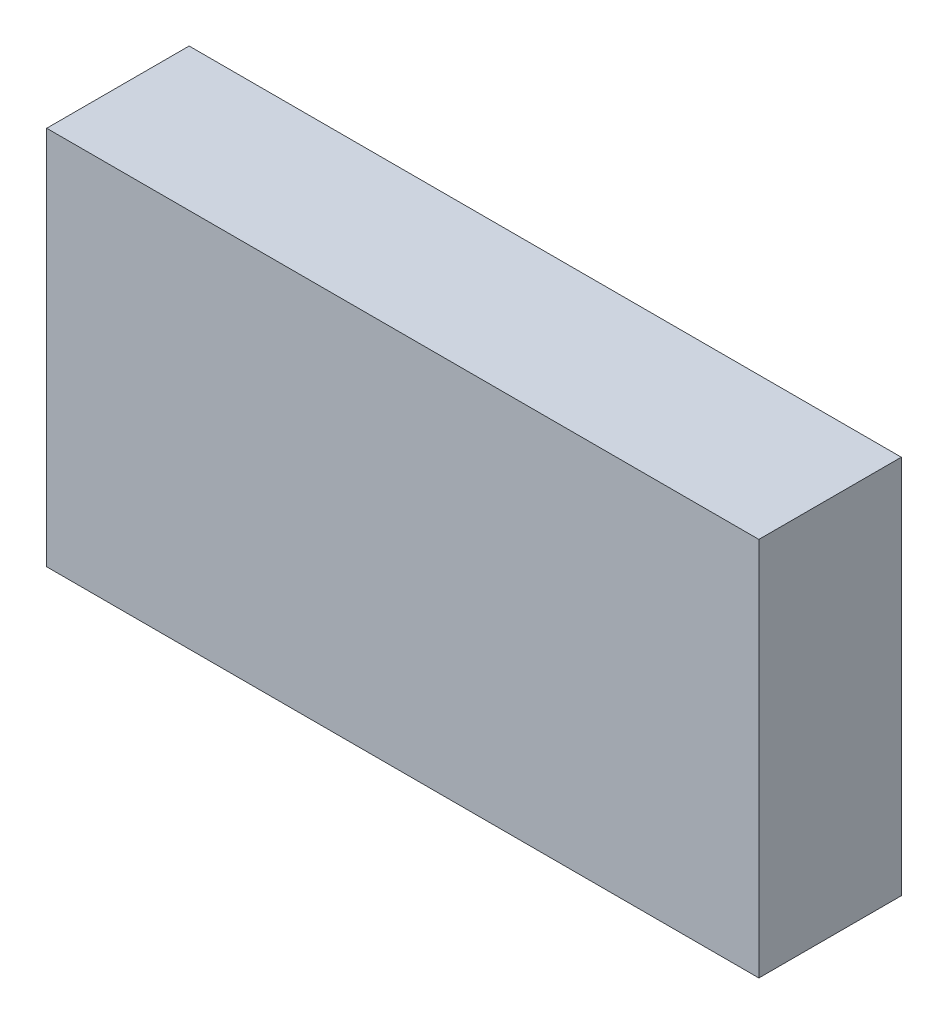
ISO-10303-21;
HEADER;
FILE_DESCRIPTION(('STEP AP214'),'2;1');
FILE_NAME('part.step','',(''),(''),'','','');
FILE_SCHEMA(('AUTOMOTIVE_DESIGN { 1 0 10303 214 1 1 1 1 }'));
ENDSEC;
DATA;
#1=APPLICATION_CONTEXT('core data for automotive mechanical design processes');
#2=APPLICATION_PROTOCOL_DEFINITION('international standard','automotive_design',2000,#1);
#3=PRODUCT_CONTEXT('',#1,'mechanical');
#4=PRODUCT('Part','Part','',(#3));
#5=PRODUCT_RELATED_PRODUCT_CATEGORY('part','',(#4));
#6=PRODUCT_DEFINITION_FORMATION('','',#4);
#7=PRODUCT_DEFINITION_CONTEXT('part definition',#1,'design');
#8=PRODUCT_DEFINITION('design','',#6,#7);
#9=PRODUCT_DEFINITION_SHAPE('','',#8);
#10=(LENGTH_UNIT() NAMED_UNIT(*) SI_UNIT(.MILLI.,.METRE.));
#11=(NAMED_UNIT(*) PLANE_ANGLE_UNIT() SI_UNIT($,.RADIAN.));
#12=(NAMED_UNIT(*) SI_UNIT($,.STERADIAN.) SOLID_ANGLE_UNIT());
#13=UNCERTAINTY_MEASURE_WITH_UNIT(LENGTH_MEASURE(1.E-05),#10,'distance_accuracy_value','');
#14=(GEOMETRIC_REPRESENTATION_CONTEXT(3) GLOBAL_UNCERTAINTY_ASSIGNED_CONTEXT((#13)) GLOBAL_UNIT_ASSIGNED_CONTEXT((#10,
#11,#12)) REPRESENTATION_CONTEXT('',''));
#15=CARTESIAN_POINT('',(0.,0.,0.));
#16=DIRECTION('',(0.,0.,1.));
#17=DIRECTION('',(1.,0.,0.));
#18=AXIS2_PLACEMENT_3D('',#15,#16,#17);
#19=CARTESIAN_POINT('',(-3.25,9.3,0.37));
#20=DIRECTION('',(0.,0.,1.));
#21=DIRECTION('',(1.,0.,0.));
#22=AXIS2_PLACEMENT_3D('',#19,#20,#21);
#23=PLANE('',#22);
#24=DIRECTION('',(1.,0.,0.));
#25=VECTOR('',#24,1.);
#26=CARTESIAN_POINT('',(-2.5,10.1,0.37));
#27=LINE('',#26,#25);
#28=CARTESIAN_POINT('',(-3.25,10.1,0.37));
#29=VERTEX_POINT('',#28);
#30=CARTESIAN_POINT('',(-1.75,10.1,0.37));
#31=VERTEX_POINT('',#30);
#32=EDGE_CURVE('E11',#29,#31,#27,.T.);
#33=ORIENTED_EDGE('',*,*,#32,.F.);
#34=DIRECTION('',(0.,1.,0.));
#35=VECTOR('',#34,1.);
#36=CARTESIAN_POINT('',(-3.25,9.7,0.37));
#37=LINE('',#36,#35);
#38=CARTESIAN_POINT('',(-3.25,9.3,0.37));
#39=VERTEX_POINT('',#38);
#40=EDGE_CURVE('E25',#39,#29,#37,.T.);
#41=ORIENTED_EDGE('',*,*,#40,.F.);
#42=DIRECTION('',(1.,0.,0.));
#43=VECTOR('',#42,1.);
#44=CARTESIAN_POINT('',(-2.5,9.3,0.37));
#45=LINE('',#44,#43);
#46=CARTESIAN_POINT('',(-1.75,9.3,0.37));
#47=VERTEX_POINT('',#46);
#48=EDGE_CURVE('E94',#39,#47,#45,.T.);
#49=ORIENTED_EDGE('',*,*,#48,.T.);
#50=DIRECTION('',(0.,1.,0.));
#51=VECTOR('',#50,1.);
#52=CARTESIAN_POINT('',(-1.75,9.7,0.37));
#53=LINE('',#52,#51);
#54=EDGE_CURVE('E90',#47,#31,#53,.T.);
#55=ORIENTED_EDGE('',*,*,#54,.T.);
#56=EDGE_LOOP('',(#33,#41,#49,#55));
#57=FACE_BOUND('',#56,.T.);
#58=ADVANCED_FACE('F17',(#57),#23,.T.);
#59=CARTESIAN_POINT('',(-1.75,9.3,0.37));
#60=DIRECTION('',(1.,0.,0.));
#61=DIRECTION('',(0.,0.,-1.));
#62=AXIS2_PLACEMENT_3D('',#59,#60,#61);
#63=PLANE('',#62);
#64=DIRECTION('',(0.,0.,-1.));
#65=VECTOR('',#64,1.);
#66=CARTESIAN_POINT('',(-1.75,10.1,0.22));
#67=LINE('',#66,#65);
#68=CARTESIAN_POINT('',(-1.75,10.1,0.07));
#69=VERTEX_POINT('',#68);
#70=EDGE_CURVE('E73',#31,#69,#67,.T.);
#71=ORIENTED_EDGE('',*,*,#70,.F.);
#72=ORIENTED_EDGE('',*,*,#54,.F.);
#73=DIRECTION('',(0.,0.,-1.));
#74=VECTOR('',#73,1.);
#75=CARTESIAN_POINT('',(-1.75,9.3,0.22));
#76=LINE('',#75,#74);
#77=CARTESIAN_POINT('',(-1.75,9.3,0.07));
#78=VERTEX_POINT('',#77);
#79=EDGE_CURVE('E76',#47,#78,#76,.T.);
#80=ORIENTED_EDGE('',*,*,#79,.T.);
#81=DIRECTION('',(0.,1.,0.));
#82=VECTOR('',#81,1.);
#83=CARTESIAN_POINT('',(-1.75,9.7,0.07));
#84=LINE('',#83,#82);
#85=EDGE_CURVE('E74',#78,#69,#84,.T.);
#86=ORIENTED_EDGE('',*,*,#85,.T.);
#87=EDGE_LOOP('',(#71,#72,#80,#86));
#88=FACE_BOUND('',#87,.T.);
#89=ADVANCED_FACE('F108',(#88),#63,.T.);
#90=CARTESIAN_POINT('',(-1.75,9.3,0.07));
#91=DIRECTION('',(0.,0.,-1.));
#92=DIRECTION('',(-1.,0.,0.));
#93=AXIS2_PLACEMENT_3D('',#90,#91,#92);
#94=PLANE('',#93);
#95=DIRECTION('',(-1.,0.,0.));
#96=VECTOR('',#95,1.);
#97=CARTESIAN_POINT('',(-2.5,10.1,0.07));
#98=LINE('',#97,#96);
#99=CARTESIAN_POINT('',(-3.25,10.1,0.07));
#100=VERTEX_POINT('',#99);
#101=EDGE_CURVE('E59',#69,#100,#98,.T.);
#102=ORIENTED_EDGE('',*,*,#101,.F.);
#103=ORIENTED_EDGE('',*,*,#85,.F.);
#104=DIRECTION('',(-1.,0.,0.));
#105=VECTOR('',#104,1.);
#106=CARTESIAN_POINT('',(-2.5,9.3,0.07));
#107=LINE('',#106,#105);
#108=CARTESIAN_POINT('',(-3.25,9.3,0.07));
#109=VERTEX_POINT('',#108);
#110=EDGE_CURVE('E62',#78,#109,#107,.T.);
#111=ORIENTED_EDGE('',*,*,#110,.T.);
#112=DIRECTION('',(0.,1.,0.));
#113=VECTOR('',#112,1.);
#114=CARTESIAN_POINT('',(-3.25,9.7,0.07));
#115=LINE('',#114,#113);
#116=EDGE_CURVE('E54',#109,#100,#115,.T.);
#117=ORIENTED_EDGE('',*,*,#116,.T.);
#118=EDGE_LOOP('',(#102,#103,#111,#117));
#119=FACE_BOUND('',#118,.T.);
#120=ADVANCED_FACE('F56',(#119),#94,.T.);
#121=CARTESIAN_POINT('',(-3.25,9.3,0.07));
#122=DIRECTION('',(-1.,0.,0.));
#123=DIRECTION('',(0.,0.,1.));
#124=AXIS2_PLACEMENT_3D('',#121,#122,#123);
#125=PLANE('',#124);
#126=DIRECTION('',(0.,0.,1.));
#127=VECTOR('',#126,1.);
#128=CARTESIAN_POINT('',(-3.25,10.1,0.22));
#129=LINE('',#128,#127);
#130=EDGE_CURVE('E65',#100,#29,#129,.T.);
#131=ORIENTED_EDGE('',*,*,#130,.F.);
#132=ORIENTED_EDGE('',*,*,#116,.F.);
#133=DIRECTION('',(0.,0.,1.));
#134=VECTOR('',#133,1.);
#135=CARTESIAN_POINT('',(-3.25,9.3,0.22));
#136=LINE('',#135,#134);
#137=EDGE_CURVE('E69',#109,#39,#136,.T.);
#138=ORIENTED_EDGE('',*,*,#137,.T.);
#139=ORIENTED_EDGE('',*,*,#40,.T.);
#140=EDGE_LOOP('',(#131,#132,#138,#139));
#141=FACE_BOUND('',#140,.T.);
#142=ADVANCED_FACE('F67',(#141),#125,.T.);
#143=CARTESIAN_POINT('',(8.7,9.3,0.));
#144=DIRECTION('',(0.,-1.,0.));
#145=DIRECTION('',(1.,0.,0.));
#146=AXIS2_PLACEMENT_3D('',#143,#144,#145);
#147=PLANE('',#146);
#148=ORIENTED_EDGE('',*,*,#48,.F.);
#149=ORIENTED_EDGE('',*,*,#137,.F.);
#150=ORIENTED_EDGE('',*,*,#110,.F.);
#151=ORIENTED_EDGE('',*,*,#79,.F.);
#152=EDGE_LOOP('',(#148,#149,#150,#151));
#153=FACE_BOUND('',#152,.T.);
#154=ADVANCED_FACE('F106',(#153),#147,.T.);
#155=CARTESIAN_POINT('',(8.7,10.1,0.));
#156=DIRECTION('',(0.,-1.,0.));
#157=DIRECTION('',(1.,0.,0.));
#158=AXIS2_PLACEMENT_3D('',#155,#156,#157);
#159=PLANE('',#158);
#160=ORIENTED_EDGE('',*,*,#70,.T.);
#161=ORIENTED_EDGE('',*,*,#101,.T.);
#162=ORIENTED_EDGE('',*,*,#130,.T.);
#163=ORIENTED_EDGE('',*,*,#32,.T.);
#164=EDGE_LOOP('',(#160,#161,#162,#163));
#165=FACE_BOUND('',#164,.T.);
#166=ADVANCED_FACE('F71',(#165),#159,.F.);
#167=CLOSED_SHELL('',(#58,#89,#120,#142,#154,#166));
#168=MANIFOLD_SOLID_BREP('B1',#167);
#169=ADVANCED_BREP_SHAPE_REPRESENTATION('',(#18,#168),#14);
#170=SHAPE_DEFINITION_REPRESENTATION(#9,#169);
ENDSEC;
END-ISO-10303-21;
